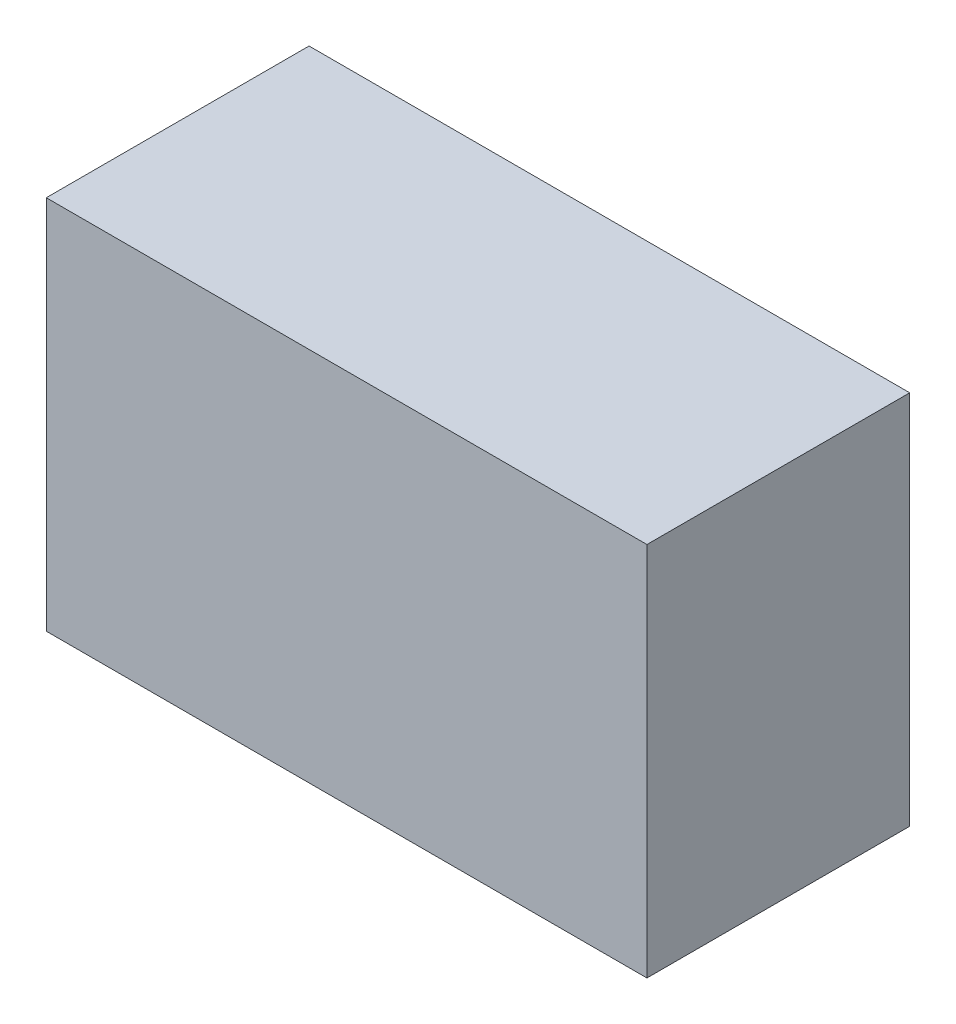
ISO-10303-21;
HEADER;
FILE_DESCRIPTION(('STEP AP214'),'2;1');
FILE_NAME('part.step','',(''),(''),'','','');
FILE_SCHEMA(('AUTOMOTIVE_DESIGN { 1 0 10303 214 1 1 1 1 }'));
ENDSEC;
DATA;
#1=APPLICATION_CONTEXT('core data for automotive mechanical design processes');
#2=APPLICATION_PROTOCOL_DEFINITION('international standard','automotive_design',2000,#1);
#3=PRODUCT_CONTEXT('',#1,'mechanical');
#4=PRODUCT('Part','Part','',(#3));
#5=PRODUCT_RELATED_PRODUCT_CATEGORY('part','',(#4));
#6=PRODUCT_DEFINITION_FORMATION('','',#4);
#7=PRODUCT_DEFINITION_CONTEXT('part definition',#1,'design');
#8=PRODUCT_DEFINITION('design','',#6,#7);
#9=PRODUCT_DEFINITION_SHAPE('','',#8);
#10=(LENGTH_UNIT() NAMED_UNIT(*) SI_UNIT(.MILLI.,.METRE.));
#11=(NAMED_UNIT(*) PLANE_ANGLE_UNIT() SI_UNIT($,.RADIAN.));
#12=(NAMED_UNIT(*) SI_UNIT($,.STERADIAN.) SOLID_ANGLE_UNIT());
#13=UNCERTAINTY_MEASURE_WITH_UNIT(LENGTH_MEASURE(1.E-05),#10,'distance_accuracy_value','');
#14=(GEOMETRIC_REPRESENTATION_CONTEXT(3) GLOBAL_UNCERTAINTY_ASSIGNED_CONTEXT((#13)) GLOBAL_UNIT_ASSIGNED_CONTEXT((#10,
#11,#12)) REPRESENTATION_CONTEXT('',''));
#15=CARTESIAN_POINT('',(0.,0.,0.));
#16=DIRECTION('',(0.,0.,1.));
#17=DIRECTION('',(1.,0.,0.));
#18=AXIS2_PLACEMENT_3D('',#15,#16,#17);
#19=CARTESIAN_POINT('',(0.,0.,0.35));
#20=DIRECTION('',(0.,0.,1.));
#21=DIRECTION('',(1.,0.,0.));
#22=AXIS2_PLACEMENT_3D('',#19,#20,#21);
#23=PLANE('',#22);
#24=DIRECTION('',(0.,1.,0.));
#25=VECTOR('',#24,1.);
#26=CARTESIAN_POINT('',(0.4,0.25,0.35));
#27=LINE('',#26,#25);
#28=CARTESIAN_POINT('',(0.4,0.25,0.35));
#29=VERTEX_POINT('',#28);
#30=CARTESIAN_POINT('',(0.4,-0.25,0.35));
#31=VERTEX_POINT('',#30);
#32=EDGE_CURVE('E53',#29,#31,#27,.F.);
#33=ORIENTED_EDGE('',*,*,#32,.F.);
#34=DIRECTION('',(1.,0.,0.));
#35=VECTOR('',#34,1.);
#36=CARTESIAN_POINT('',(-0.4,0.25,0.35));
#37=LINE('',#36,#35);
#38=CARTESIAN_POINT('',(-0.4,0.25,0.35));
#39=VERTEX_POINT('',#38);
#40=EDGE_CURVE('E68',#39,#29,#37,.T.);
#41=ORIENTED_EDGE('',*,*,#40,.F.);
#42=DIRECTION('',(0.,1.,0.));
#43=VECTOR('',#42,1.);
#44=CARTESIAN_POINT('',(-0.4,-0.25,0.35));
#45=LINE('',#44,#43);
#46=CARTESIAN_POINT('',(-0.4,-0.25,0.35));
#47=VERTEX_POINT('',#46);
#48=EDGE_CURVE('E20',#47,#39,#45,.T.);
#49=ORIENTED_EDGE('',*,*,#48,.F.);
#50=DIRECTION('',(1.,0.,0.));
#51=VECTOR('',#50,1.);
#52=CARTESIAN_POINT('',(0.4,-0.25,0.35));
#53=LINE('',#52,#51);
#54=EDGE_CURVE('E58',#31,#47,#53,.F.);
#55=ORIENTED_EDGE('',*,*,#54,.F.);
#56=EDGE_LOOP('',(#33,#41,#49,#55));
#57=FACE_BOUND('',#56,.T.);
#58=ADVANCED_FACE('F17',(#57),#23,.T.);
#59=CARTESIAN_POINT('',(-0.4,-0.25,0.));
#60=DIRECTION('',(-1.,0.,0.));
#61=DIRECTION('',(0.,0.,1.));
#62=AXIS2_PLACEMENT_3D('',#59,#60,#61);
#63=PLANE('',#62);
#64=DIRECTION('',(0.,0.,1.));
#65=VECTOR('',#64,1.);
#66=CARTESIAN_POINT('',(-0.4,0.25,0.));
#67=LINE('',#66,#65);
#68=CARTESIAN_POINT('',(-0.4,0.25,0.));
#69=VERTEX_POINT('',#68);
#70=EDGE_CURVE('E79',#69,#39,#67,.T.);
#71=ORIENTED_EDGE('',*,*,#70,.F.);
#72=DIRECTION('',(0.,1.,0.));
#73=VECTOR('',#72,1.);
#74=CARTESIAN_POINT('',(-0.4,0.,0.));
#75=LINE('',#74,#73);
#76=CARTESIAN_POINT('',(-0.4,-0.25,0.));
#77=VERTEX_POINT('',#76);
#78=EDGE_CURVE('E74',#69,#77,#75,.F.);
#79=ORIENTED_EDGE('',*,*,#78,.T.);
#80=DIRECTION('',(0.,0.,-1.));
#81=VECTOR('',#80,1.);
#82=CARTESIAN_POINT('',(-0.4,-0.25,0.));
#83=LINE('',#82,#81);
#84=EDGE_CURVE('E63',#47,#77,#83,.T.);
#85=ORIENTED_EDGE('',*,*,#84,.F.);
#86=ORIENTED_EDGE('',*,*,#48,.T.);
#87=EDGE_LOOP('',(#71,#79,#85,#86));
#88=FACE_BOUND('',#87,.T.);
#89=ADVANCED_FACE('F73',(#88),#63,.T.);
#90=CARTESIAN_POINT('',(0.4,-0.25,0.));
#91=DIRECTION('',(0.,-1.,0.));
#92=DIRECTION('',(0.,0.,-1.));
#93=AXIS2_PLACEMENT_3D('',#90,#91,#92);
#94=PLANE('',#93);
#95=ORIENTED_EDGE('',*,*,#84,.T.);
#96=DIRECTION('',(1.,0.,0.));
#97=VECTOR('',#96,1.);
#98=CARTESIAN_POINT('',(0.,-0.25,0.));
#99=LINE('',#98,#97);
#100=CARTESIAN_POINT('',(0.4,-0.25,0.));
#101=VERTEX_POINT('',#100);
#102=EDGE_CURVE('E84',#77,#101,#99,.T.);
#103=ORIENTED_EDGE('',*,*,#102,.T.);
#104=DIRECTION('',(0.,0.,-1.));
#105=VECTOR('',#104,1.);
#106=CARTESIAN_POINT('',(0.4,-0.25,0.));
#107=LINE('',#106,#105);
#108=EDGE_CURVE('E65',#31,#101,#107,.T.);
#109=ORIENTED_EDGE('',*,*,#108,.F.);
#110=ORIENTED_EDGE('',*,*,#54,.T.);
#111=EDGE_LOOP('',(#95,#103,#109,#110));
#112=FACE_BOUND('',#111,.T.);
#113=ADVANCED_FACE('F60',(#112),#94,.T.);
#114=CARTESIAN_POINT('',(0.4,0.25,0.));
#115=DIRECTION('',(1.,0.,0.));
#116=DIRECTION('',(0.,0.,-1.));
#117=AXIS2_PLACEMENT_3D('',#114,#115,#116);
#118=PLANE('',#117);
#119=ORIENTED_EDGE('',*,*,#108,.T.);
#120=DIRECTION('',(0.,1.,0.));
#121=VECTOR('',#120,1.);
#122=CARTESIAN_POINT('',(0.4,0.,0.));
#123=LINE('',#122,#121);
#124=CARTESIAN_POINT('',(0.4,0.25,0.));
#125=VERTEX_POINT('',#124);
#126=EDGE_CURVE('E26',#101,#125,#123,.T.);
#127=ORIENTED_EDGE('',*,*,#126,.T.);
#128=DIRECTION('',(0.,0.,1.));
#129=VECTOR('',#128,1.);
#130=CARTESIAN_POINT('',(0.4,0.25,0.));
#131=LINE('',#130,#129);
#132=EDGE_CURVE('E34',#29,#125,#131,.F.);
#133=ORIENTED_EDGE('',*,*,#132,.F.);
#134=ORIENTED_EDGE('',*,*,#32,.T.);
#135=EDGE_LOOP('',(#119,#127,#133,#134));
#136=FACE_BOUND('',#135,.T.);
#137=ADVANCED_FACE('F88',(#136),#118,.T.);
#138=CARTESIAN_POINT('',(-0.4,0.25,0.));
#139=DIRECTION('',(0.,1.,0.));
#140=DIRECTION('',(0.,0.,1.));
#141=AXIS2_PLACEMENT_3D('',#138,#139,#140);
#142=PLANE('',#141);
#143=ORIENTED_EDGE('',*,*,#132,.T.);
#144=DIRECTION('',(1.,0.,0.));
#145=VECTOR('',#144,1.);
#146=CARTESIAN_POINT('',(0.,0.25,0.));
#147=LINE('',#146,#145);
#148=EDGE_CURVE('E11',#125,#69,#147,.F.);
#149=ORIENTED_EDGE('',*,*,#148,.T.);
#150=ORIENTED_EDGE('',*,*,#70,.T.);
#151=ORIENTED_EDGE('',*,*,#40,.T.);
#152=EDGE_LOOP('',(#143,#149,#150,#151));
#153=FACE_BOUND('',#152,.T.);
#154=ADVANCED_FACE('F91',(#153),#142,.T.);
#155=CARTESIAN_POINT('',(0.,0.,0.));
#156=DIRECTION('',(0.,0.,1.));
#157=DIRECTION('',(1.,0.,0.));
#158=AXIS2_PLACEMENT_3D('',#155,#156,#157);
#159=PLANE('',#158);
#160=ORIENTED_EDGE('',*,*,#126,.F.);
#161=ORIENTED_EDGE('',*,*,#102,.F.);
#162=ORIENTED_EDGE('',*,*,#78,.F.);
#163=ORIENTED_EDGE('',*,*,#148,.F.);
#164=EDGE_LOOP('',(#160,#161,#162,#163));
#165=FACE_BOUND('',#164,.T.);
#166=ADVANCED_FACE('F90',(#165),#159,.F.);
#167=CLOSED_SHELL('',(#58,#89,#113,#137,#154,#166));
#168=MANIFOLD_SOLID_BREP('B1',#167);
#169=ADVANCED_BREP_SHAPE_REPRESENTATION('',(#18,#168),#14);
#170=SHAPE_DEFINITION_REPRESENTATION(#9,#169);
ENDSEC;
END-ISO-10303-21;
